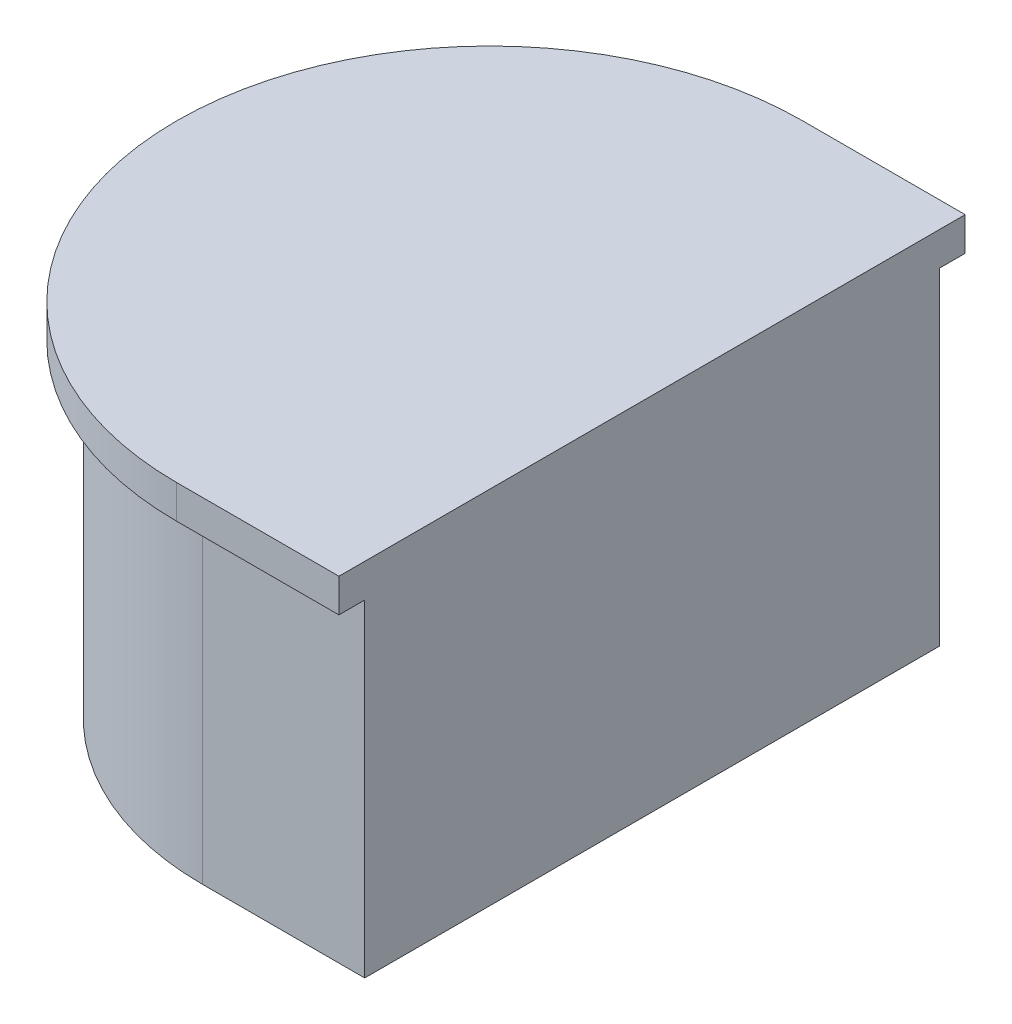
ISO-10303-21;
HEADER;
FILE_DESCRIPTION(('STEP AP214'),'2;1');
FILE_NAME('part.step','',(''),(''),'','','');
FILE_SCHEMA(('AUTOMOTIVE_DESIGN { 1 0 10303 214 1 1 1 1 }'));
ENDSEC;
DATA;
#1=APPLICATION_CONTEXT('core data for automotive mechanical design processes');
#2=APPLICATION_PROTOCOL_DEFINITION('international standard','automotive_design',2000,#1);
#3=PRODUCT_CONTEXT('',#1,'mechanical');
#4=PRODUCT('Part','Part','',(#3));
#5=PRODUCT_RELATED_PRODUCT_CATEGORY('part','',(#4));
#6=PRODUCT_DEFINITION_FORMATION('','',#4);
#7=PRODUCT_DEFINITION_CONTEXT('part definition',#1,'design');
#8=PRODUCT_DEFINITION('design','',#6,#7);
#9=PRODUCT_DEFINITION_SHAPE('','',#8);
#10=(LENGTH_UNIT() NAMED_UNIT(*) SI_UNIT(.MILLI.,.METRE.));
#11=(NAMED_UNIT(*) PLANE_ANGLE_UNIT() SI_UNIT($,.RADIAN.));
#12=(NAMED_UNIT(*) SI_UNIT($,.STERADIAN.) SOLID_ANGLE_UNIT());
#13=UNCERTAINTY_MEASURE_WITH_UNIT(LENGTH_MEASURE(1.E-05),#10,'distance_accuracy_value','');
#14=(GEOMETRIC_REPRESENTATION_CONTEXT(3) GLOBAL_UNCERTAINTY_ASSIGNED_CONTEXT((#13)) GLOBAL_UNIT_ASSIGNED_CONTEXT((#10,
#11,#12)) REPRESENTATION_CONTEXT('',''));
#15=CARTESIAN_POINT('',(0.,0.,0.));
#16=DIRECTION('',(0.,0.,1.));
#17=DIRECTION('',(1.,0.,0.));
#18=AXIS2_PLACEMENT_3D('',#15,#16,#17);
#19=CARTESIAN_POINT('',(17.9810102548469,28.,-21.3766073858885));
#20=DIRECTION('',(0.,0.,1.));
#21=DIRECTION('',(1.,0.,0.));
#22=AXIS2_PLACEMENT_3D('',#19,#20,#21);
#23=PLANE('',#22);
#24=DIRECTION('',(1.,0.,0.));
#25=VECTOR('',#24,1.);
#26=CARTESIAN_POINT('',(17.9810102548469,25.4,-21.3766073858885));
#27=LINE('',#26,#25);
#28=CARTESIAN_POINT('',(5.37982225484685,25.4,-21.3766073858885));
#29=VERTEX_POINT('',#28);
#30=CARTESIAN_POINT('',(17.9810102548469,25.4,-21.3766073858885));
#31=VERTEX_POINT('',#30);
#32=EDGE_CURVE('E105',#29,#31,#27,.T.);
#33=ORIENTED_EDGE('',*,*,#32,.T.);
#34=DIRECTION('',(0.,-1.,0.));
#35=VECTOR('',#34,1.);
#36=CARTESIAN_POINT('',(17.9810102548469,28.,-21.3766073858885));
#37=LINE('',#36,#35);
#38=CARTESIAN_POINT('',(17.9810102548469,0.,-21.3766073858885));
#39=VERTEX_POINT('',#38);
#40=EDGE_CURVE('E11',#31,#39,#37,.T.);
#41=ORIENTED_EDGE('',*,*,#40,.T.);
#42=DIRECTION('',(-1.,0.,0.));
#43=VECTOR('',#42,1.);
#44=CARTESIAN_POINT('',(17.9810102548469,0.,-21.3766073858885));
#45=LINE('',#44,#43);
#46=CARTESIAN_POINT('',(5.37982225484685,0.,-21.3766073858885));
#47=VERTEX_POINT('',#46);
#48=EDGE_CURVE('E123',#39,#47,#45,.T.);
#49=ORIENTED_EDGE('',*,*,#48,.T.);
#50=DIRECTION('',(0.,-1.,0.));
#51=VECTOR('',#50,1.);
#52=CARTESIAN_POINT('',(5.37982225484685,28.,-21.3766073858885));
#53=LINE('',#52,#51);
#54=EDGE_CURVE('E42',#29,#47,#53,.T.);
#55=ORIENTED_EDGE('',*,*,#54,.F.);
#56=EDGE_LOOP('',(#33,#41,#49,#55));
#57=FACE_BOUND('',#56,.T.);
#58=ADVANCED_FACE('F34',(#57),#23,.F.);
#59=CARTESIAN_POINT('',(5.37982225484685,28.,0.921125619026367));
#60=DIRECTION('',(0.,-1.,0.));
#61=DIRECTION('',(0.,0.,-1.));
#62=AXIS2_PLACEMENT_3D('',#59,#60,#61);
#63=CYLINDRICAL_SURFACE('',#62,22.2977330049148);
#64=CARTESIAN_POINT('',(5.37982225484685,25.4,0.921125619026367));
#65=DIRECTION('',(0.,-1.,0.));
#66=DIRECTION('',(0.,0.,1.));
#67=AXIS2_PLACEMENT_3D('',#64,#65,#66);
#68=CIRCLE('',#67,22.2977330049148);
#69=CARTESIAN_POINT('',(5.37982225484685,25.4,23.2188586239412));
#70=VERTEX_POINT('',#69);
#71=EDGE_CURVE('E100',#70,#29,#68,.T.);
#72=ORIENTED_EDGE('',*,*,#71,.T.);
#73=ORIENTED_EDGE('',*,*,#54,.T.);
#74=CARTESIAN_POINT('',(5.37982225484685,0.,0.921125619026367));
#75=DIRECTION('',(0.,1.,0.));
#76=DIRECTION('',(0.,0.,1.));
#77=AXIS2_PLACEMENT_3D('',#74,#75,#76);
#78=CIRCLE('',#77,22.2977330049148);
#79=CARTESIAN_POINT('',(5.37982225484685,0.,23.2188586239412));
#80=VERTEX_POINT('',#79);
#81=EDGE_CURVE('E114',#47,#80,#78,.T.);
#82=ORIENTED_EDGE('',*,*,#81,.T.);
#83=DIRECTION('',(0.,-1.,0.));
#84=VECTOR('',#83,1.);
#85=CARTESIAN_POINT('',(5.37982225484685,28.,23.2188586239412));
#86=LINE('',#85,#84);
#87=EDGE_CURVE('E56',#70,#80,#86,.T.);
#88=ORIENTED_EDGE('',*,*,#87,.F.);
#89=EDGE_LOOP('',(#72,#73,#82,#88));
#90=FACE_BOUND('',#89,.T.);
#91=ADVANCED_FACE('F112',(#90),#63,.T.);
#92=CARTESIAN_POINT('',(5.37982225484685,28.,23.2188586239412));
#93=DIRECTION('',(0.,0.,-1.));
#94=DIRECTION('',(-1.,0.,0.));
#95=AXIS2_PLACEMENT_3D('',#92,#93,#94);
#96=PLANE('',#95);
#97=DIRECTION('',(-1.,0.,0.));
#98=VECTOR('',#97,1.);
#99=CARTESIAN_POINT('',(5.37982225484685,25.4,23.2188586239412));
#100=LINE('',#99,#98);
#101=CARTESIAN_POINT('',(17.9810102548469,25.4,23.2188586239412));
#102=VERTEX_POINT('',#101);
#103=EDGE_CURVE('E103',#102,#70,#100,.T.);
#104=ORIENTED_EDGE('',*,*,#103,.T.);
#105=ORIENTED_EDGE('',*,*,#87,.T.);
#106=DIRECTION('',(1.,0.,0.));
#107=VECTOR('',#106,1.);
#108=CARTESIAN_POINT('',(5.37982225484685,0.,23.2188586239412));
#109=LINE('',#108,#107);
#110=CARTESIAN_POINT('',(17.9810102548469,0.,23.2188586239412));
#111=VERTEX_POINT('',#110);
#112=EDGE_CURVE('E120',#80,#111,#109,.T.);
#113=ORIENTED_EDGE('',*,*,#112,.T.);
#114=DIRECTION('',(0.,-1.,0.));
#115=VECTOR('',#114,1.);
#116=CARTESIAN_POINT('',(17.9810102548469,28.,23.2188586239412));
#117=LINE('',#116,#115);
#118=EDGE_CURVE('E49',#102,#111,#117,.T.);
#119=ORIENTED_EDGE('',*,*,#118,.F.);
#120=EDGE_LOOP('',(#104,#105,#113,#119));
#121=FACE_BOUND('',#120,.T.);
#122=ADVANCED_FACE('F109',(#121),#96,.F.);
#123=CARTESIAN_POINT('',(17.9810102548469,28.,-21.3766073858885));
#124=DIRECTION('',(-1.,0.,0.));
#125=DIRECTION('',(0.,0.,1.));
#126=AXIS2_PLACEMENT_3D('',#123,#124,#125);
#127=PLANE('',#126);
#128=DIRECTION('',(0.,0.,-1.));
#129=VECTOR('',#128,1.);
#130=CARTESIAN_POINT('',(17.9810102548469,0.,-21.3766073858885));
#131=LINE('',#130,#129);
#132=EDGE_CURVE('E126',#111,#39,#131,.T.);
#133=ORIENTED_EDGE('',*,*,#132,.T.);
#134=ORIENTED_EDGE('',*,*,#40,.F.);
#135=DIRECTION('',(0.,0.,-1.));
#136=VECTOR('',#135,1.);
#137=CARTESIAN_POINT('',(17.9810102548469,25.4,-23.3766073858885));
#138=LINE('',#137,#136);
#139=CARTESIAN_POINT('',(17.9810102548469,25.4,-23.3766073858885));
#140=VERTEX_POINT('',#139);
#141=EDGE_CURVE('E158',#31,#140,#138,.T.);
#142=ORIENTED_EDGE('',*,*,#141,.T.);
#143=DIRECTION('',(0.,1.,0.));
#144=VECTOR('',#143,1.);
#145=CARTESIAN_POINT('',(17.9810102548469,25.4,-23.3766073858885));
#146=LINE('',#145,#144);
#147=CARTESIAN_POINT('',(17.9810102548469,28.,-23.3766073858885));
#148=VERTEX_POINT('',#147);
#149=EDGE_CURVE('E130',#140,#148,#146,.T.);
#150=ORIENTED_EDGE('',*,*,#149,.T.);
#151=DIRECTION('',(0.,0.,-1.));
#152=VECTOR('',#151,1.);
#153=CARTESIAN_POINT('',(17.9810102548469,28.,-21.3766073858885));
#154=LINE('',#153,#152);
#155=CARTESIAN_POINT('',(17.9810102548469,28.,25.2188586239412));
#156=VERTEX_POINT('',#155);
#157=EDGE_CURVE('E117',#156,#148,#154,.T.);
#158=ORIENTED_EDGE('',*,*,#157,.F.);
#159=DIRECTION('',(0.,1.,0.));
#160=VECTOR('',#159,1.);
#161=CARTESIAN_POINT('',(17.9810102548469,25.4,25.2188586239412));
#162=LINE('',#161,#160);
#163=CARTESIAN_POINT('',(17.9810102548469,25.4,25.2188586239412));
#164=VERTEX_POINT('',#163);
#165=EDGE_CURVE('E128',#164,#156,#162,.T.);
#166=ORIENTED_EDGE('',*,*,#165,.F.);
#167=DIRECTION('',(0.,0.,-1.));
#168=VECTOR('',#167,1.);
#169=CARTESIAN_POINT('',(17.9810102548469,25.4,23.2188586239412));
#170=LINE('',#169,#168);
#171=EDGE_CURVE('E134',#164,#102,#170,.T.);
#172=ORIENTED_EDGE('',*,*,#171,.T.);
#173=ORIENTED_EDGE('',*,*,#118,.T.);
#174=EDGE_LOOP('',(#133,#134,#142,#150,#158,#166,#172,#173));
#175=FACE_BOUND('',#174,.T.);
#176=ADVANCED_FACE('F36',(#175),#127,.F.);
#177=CARTESIAN_POINT('',(5.37982225484685,28.,0.921125619026367));
#178=DIRECTION('',(0.,1.,0.));
#179=DIRECTION('',(0.,0.,1.));
#180=AXIS2_PLACEMENT_3D('',#177,#178,#179);
#181=PLANE('',#180);
#182=DIRECTION('',(1.,0.,0.));
#183=VECTOR('',#182,1.);
#184=CARTESIAN_POINT('',(5.37982225484685,28.,25.2188586239412));
#185=LINE('',#184,#183);
#186=CARTESIAN_POINT('',(5.37982225484685,28.,25.2188586239412));
#187=VERTEX_POINT('',#186);
#188=EDGE_CURVE('E110',#187,#156,#185,.T.);
#189=ORIENTED_EDGE('',*,*,#188,.T.);
#190=ORIENTED_EDGE('',*,*,#157,.T.);
#191=DIRECTION('',(-1.,0.,0.));
#192=VECTOR('',#191,1.);
#193=CARTESIAN_POINT('',(17.9810102548469,28.,-23.3766073858885));
#194=LINE('',#193,#192);
#195=CARTESIAN_POINT('',(5.37982225484685,28.,-23.3766073858885));
#196=VERTEX_POINT('',#195);
#197=EDGE_CURVE('E145',#148,#196,#194,.T.);
#198=ORIENTED_EDGE('',*,*,#197,.T.);
#199=CARTESIAN_POINT('',(5.37982225484685,28.,0.921125619026367));
#200=DIRECTION('',(0.,1.,0.));
#201=DIRECTION('',(0.,0.,1.));
#202=AXIS2_PLACEMENT_3D('',#199,#200,#201);
#203=CIRCLE('',#202,24.2977330049148);
#204=EDGE_CURVE('E142',#196,#187,#203,.T.);
#205=ORIENTED_EDGE('',*,*,#204,.T.);
#206=EDGE_LOOP('',(#189,#190,#198,#205));
#207=FACE_BOUND('',#206,.T.);
#208=ADVANCED_FACE('F169',(#207),#181,.T.);
#209=CARTESIAN_POINT('',(5.37982225484685,0.,0.921125619026367));
#210=DIRECTION('',(0.,1.,0.));
#211=DIRECTION('',(0.,0.,1.));
#212=AXIS2_PLACEMENT_3D('',#209,#210,#211);
#213=PLANE('',#212);
#214=ORIENTED_EDGE('',*,*,#132,.F.);
#215=ORIENTED_EDGE('',*,*,#112,.F.);
#216=ORIENTED_EDGE('',*,*,#81,.F.);
#217=ORIENTED_EDGE('',*,*,#48,.F.);
#218=EDGE_LOOP('',(#214,#215,#216,#217));
#219=FACE_BOUND('',#218,.T.);
#220=ADVANCED_FACE('F166',(#219),#213,.F.);
#221=CARTESIAN_POINT('',(5.37982225484685,25.4,25.2188586239412));
#222=DIRECTION('',(0.,0.,1.));
#223=DIRECTION('',(1.,0.,0.));
#224=AXIS2_PLACEMENT_3D('',#221,#222,#223);
#225=PLANE('',#224);
#226=ORIENTED_EDGE('',*,*,#188,.F.);
#227=DIRECTION('',(0.,1.,0.));
#228=VECTOR('',#227,1.);
#229=CARTESIAN_POINT('',(5.37982225484685,25.4,25.2188586239412));
#230=LINE('',#229,#228);
#231=CARTESIAN_POINT('',(5.37982225484685,25.4,25.2188586239412));
#232=VERTEX_POINT('',#231);
#233=EDGE_CURVE('E136',#232,#187,#230,.T.);
#234=ORIENTED_EDGE('',*,*,#233,.F.);
#235=DIRECTION('',(1.,0.,0.));
#236=VECTOR('',#235,1.);
#237=CARTESIAN_POINT('',(5.37982225484685,25.4,25.2188586239412));
#238=LINE('',#237,#236);
#239=EDGE_CURVE('E149',#232,#164,#238,.T.);
#240=ORIENTED_EDGE('',*,*,#239,.T.);
#241=ORIENTED_EDGE('',*,*,#165,.T.);
#242=EDGE_LOOP('',(#226,#234,#240,#241));
#243=FACE_BOUND('',#242,.T.);
#244=ADVANCED_FACE('F168',(#243),#225,.T.);
#245=CARTESIAN_POINT('',(5.37982225484685,25.4,0.921125619026367));
#246=DIRECTION('',(0.,1.,0.));
#247=DIRECTION('',(0.,0.,1.));
#248=AXIS2_PLACEMENT_3D('',#245,#246,#247);
#249=CYLINDRICAL_SURFACE('',#248,24.2977330049148);
#250=ORIENTED_EDGE('',*,*,#204,.F.);
#251=DIRECTION('',(0.,1.,0.));
#252=VECTOR('',#251,1.);
#253=CARTESIAN_POINT('',(5.37982225484685,25.4,-23.3766073858885));
#254=LINE('',#253,#252);
#255=CARTESIAN_POINT('',(5.37982225484685,25.4,-23.3766073858885));
#256=VERTEX_POINT('',#255);
#257=EDGE_CURVE('E133',#256,#196,#254,.T.);
#258=ORIENTED_EDGE('',*,*,#257,.F.);
#259=CARTESIAN_POINT('',(5.37982225484685,25.4,0.921125619026367));
#260=DIRECTION('',(0.,1.,0.));
#261=DIRECTION('',(0.,0.,1.));
#262=AXIS2_PLACEMENT_3D('',#259,#260,#261);
#263=CIRCLE('',#262,24.2977330049148);
#264=EDGE_CURVE('E152',#256,#232,#263,.T.);
#265=ORIENTED_EDGE('',*,*,#264,.T.);
#266=ORIENTED_EDGE('',*,*,#233,.T.);
#267=EDGE_LOOP('',(#250,#258,#265,#266));
#268=FACE_BOUND('',#267,.T.);
#269=ADVANCED_FACE('F175',(#268),#249,.T.);
#270=CARTESIAN_POINT('',(17.9810102548469,25.4,-23.3766073858885));
#271=DIRECTION('',(0.,0.,-1.));
#272=DIRECTION('',(-1.,0.,0.));
#273=AXIS2_PLACEMENT_3D('',#270,#271,#272);
#274=PLANE('',#273);
#275=ORIENTED_EDGE('',*,*,#197,.F.);
#276=ORIENTED_EDGE('',*,*,#149,.F.);
#277=DIRECTION('',(-1.,0.,0.));
#278=VECTOR('',#277,1.);
#279=CARTESIAN_POINT('',(17.9810102548469,25.4,-23.3766073858885));
#280=LINE('',#279,#278);
#281=EDGE_CURVE('E155',#140,#256,#280,.T.);
#282=ORIENTED_EDGE('',*,*,#281,.T.);
#283=ORIENTED_EDGE('',*,*,#257,.T.);
#284=EDGE_LOOP('',(#275,#276,#282,#283));
#285=FACE_BOUND('',#284,.T.);
#286=ADVANCED_FACE('F212',(#285),#274,.T.);
#287=CARTESIAN_POINT('',(5.37982225484685,25.4,0.921125619026367));
#288=DIRECTION('',(0.,1.,0.));
#289=DIRECTION('',(0.,0.,1.));
#290=AXIS2_PLACEMENT_3D('',#287,#288,#289);
#291=PLANE('',#290);
#292=ORIENTED_EDGE('',*,*,#103,.F.);
#293=ORIENTED_EDGE('',*,*,#171,.F.);
#294=ORIENTED_EDGE('',*,*,#239,.F.);
#295=ORIENTED_EDGE('',*,*,#264,.F.);
#296=ORIENTED_EDGE('',*,*,#281,.F.);
#297=ORIENTED_EDGE('',*,*,#141,.F.);
#298=ORIENTED_EDGE('',*,*,#32,.F.);
#299=ORIENTED_EDGE('',*,*,#71,.F.);
#300=EDGE_LOOP('',(#292,#293,#294,#295,#296,#297,#298,#299));
#301=FACE_BOUND('',#300,.T.);
#302=ADVANCED_FACE('F101',(#301),#291,.F.);
#303=CLOSED_SHELL('',(#58,#91,#122,#176,#208,#220,#244,#269,#286,#302));
#304=MANIFOLD_SOLID_BREP('B2',#303);
#305=ADVANCED_BREP_SHAPE_REPRESENTATION('',(#18,#304),#14);
#306=SHAPE_DEFINITION_REPRESENTATION(#9,#305);
ENDSEC;
END-ISO-10303-21;
